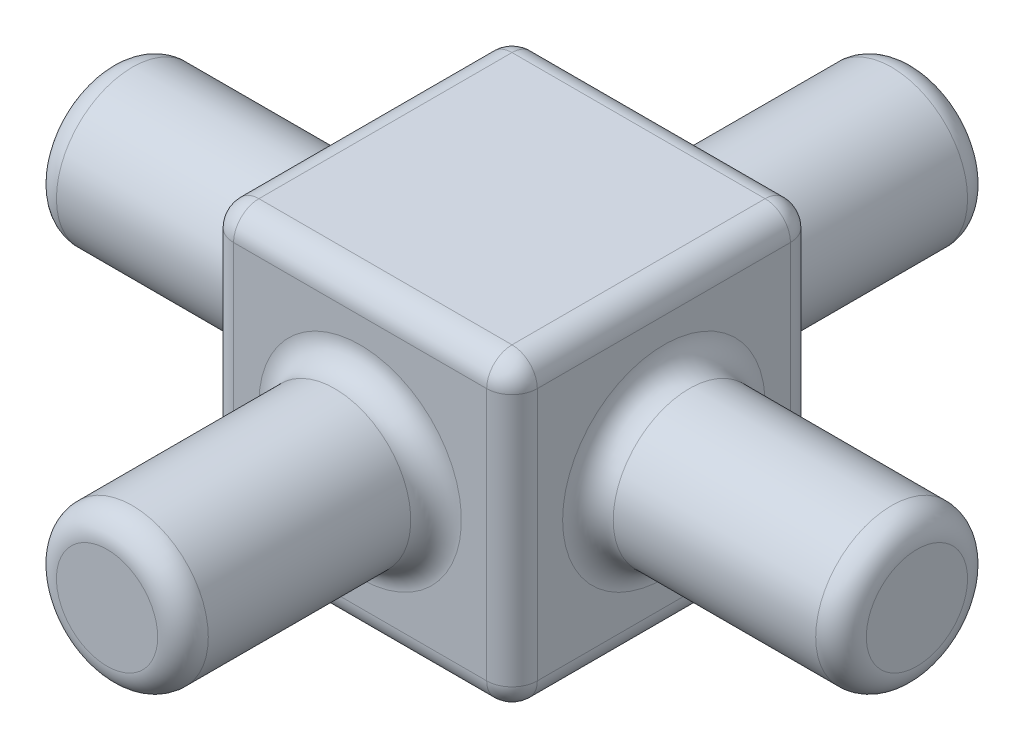
ISO-10303-21;
HEADER;
FILE_DESCRIPTION(('STEP AP214'),'2;1');
FILE_NAME('part.step','',(''),(''),'','','');
FILE_SCHEMA(('AUTOMOTIVE_DESIGN { 1 0 10303 214 1 1 1 1 }'));
ENDSEC;
DATA;
#1=APPLICATION_CONTEXT('core data for automotive mechanical design processes');
#2=APPLICATION_PROTOCOL_DEFINITION('international standard','automotive_design',2000,#1);
#3=PRODUCT_CONTEXT('',#1,'mechanical');
#4=PRODUCT('Part','Part','',(#3));
#5=PRODUCT_RELATED_PRODUCT_CATEGORY('part','',(#4));
#6=PRODUCT_DEFINITION_FORMATION('','',#4);
#7=PRODUCT_DEFINITION_CONTEXT('part definition',#1,'design');
#8=PRODUCT_DEFINITION('design','',#6,#7);
#9=PRODUCT_DEFINITION_SHAPE('','',#8);
#10=(LENGTH_UNIT() NAMED_UNIT(*) SI_UNIT(.MILLI.,.METRE.));
#11=(NAMED_UNIT(*) PLANE_ANGLE_UNIT() SI_UNIT($,.RADIAN.));
#12=(NAMED_UNIT(*) SI_UNIT($,.STERADIAN.) SOLID_ANGLE_UNIT());
#13=UNCERTAINTY_MEASURE_WITH_UNIT(LENGTH_MEASURE(1.E-05),#10,'distance_accuracy_value','');
#14=(GEOMETRIC_REPRESENTATION_CONTEXT(3) GLOBAL_UNCERTAINTY_ASSIGNED_CONTEXT((#13)) GLOBAL_UNIT_ASSIGNED_CONTEXT((#10,
#11,#12)) REPRESENTATION_CONTEXT('',''));
#15=CARTESIAN_POINT('',(0.,0.,0.));
#16=DIRECTION('',(0.,0.,1.));
#17=DIRECTION('',(1.,0.,0.));
#18=AXIS2_PLACEMENT_3D('',#15,#16,#17);
#19=CARTESIAN_POINT('',(3.,3.,3.));
#20=DIRECTION('',(-1.,0.,0.));
#21=DIRECTION('',(0.,0.,1.));
#22=AXIS2_PLACEMENT_3D('',#19,#20,#21);
#23=PLANE('',#22);
#24=CARTESIAN_POINT('',(3.,0.,0.));
#25=DIRECTION('',(-1.,0.,0.));
#26=DIRECTION('',(0.,0.,1.));
#27=AXIS2_PLACEMENT_3D('',#24,#25,#26);
#28=CIRCLE('',#27,2.);
#29=CARTESIAN_POINT('',(3.,0.,1.99999999999999));
#30=VERTEX_POINT('',#29);
#31=EDGE_CURVE('E169',#30,#30,#28,.T.);
#32=ORIENTED_EDGE('',*,*,#31,.T.);
#33=EDGE_LOOP('',(#32));
#34=FACE_BOUND('',#33,.T.);
#35=DIRECTION('',(0.,0.,-1.));
#36=VECTOR('',#35,1.);
#37=CARTESIAN_POINT('',(3.,-2.5,-3.));
#38=LINE('',#37,#36);
#39=CARTESIAN_POINT('',(3.,-2.5,2.5));
#40=VERTEX_POINT('',#39);
#41=CARTESIAN_POINT('',(3.,-2.5,-2.5));
#42=VERTEX_POINT('',#41);
#43=EDGE_CURVE('E167',#40,#42,#38,.T.);
#44=ORIENTED_EDGE('',*,*,#43,.T.);
#45=DIRECTION('',(0.,-1.,0.));
#46=VECTOR('',#45,1.);
#47=CARTESIAN_POINT('',(3.,3.,-2.5));
#48=LINE('',#47,#46);
#49=CARTESIAN_POINT('',(3.,2.5,-2.5));
#50=VERTEX_POINT('',#49);
#51=EDGE_CURVE('E159',#42,#50,#48,.F.);
#52=ORIENTED_EDGE('',*,*,#51,.T.);
#53=DIRECTION('',(0.,0.,-1.));
#54=VECTOR('',#53,1.);
#55=CARTESIAN_POINT('',(3.,2.5,3.));
#56=LINE('',#55,#54);
#57=CARTESIAN_POINT('',(3.,2.5,2.5));
#58=VERTEX_POINT('',#57);
#59=EDGE_CURVE('E129',#50,#58,#56,.F.);
#60=ORIENTED_EDGE('',*,*,#59,.T.);
#61=DIRECTION('',(0.,-1.,0.));
#62=VECTOR('',#61,1.);
#63=CARTESIAN_POINT('',(3.,3.,2.5));
#64=LINE('',#63,#62);
#65=EDGE_CURVE('E140',#58,#40,#64,.T.);
#66=ORIENTED_EDGE('',*,*,#65,.T.);
#67=EDGE_LOOP('',(#44,#52,#60,#66));
#68=FACE_BOUND('',#67,.T.);
#69=ADVANCED_FACE('F39',(#34,#68),#23,.F.);
#70=CARTESIAN_POINT('',(-3.,3.,-3.));
#71=DIRECTION('',(0.,0.,1.));
#72=DIRECTION('',(1.,0.,0.));
#73=AXIS2_PLACEMENT_3D('',#70,#71,#72);
#74=PLANE('',#73);
#75=CARTESIAN_POINT('',(0.,0.,-3.));
#76=DIRECTION('',(0.,0.,1.));
#77=DIRECTION('',(1.,0.,0.));
#78=AXIS2_PLACEMENT_3D('',#75,#76,#77);
#79=CIRCLE('',#78,2.);
#80=CARTESIAN_POINT('',(2.,0.,-3.));
#81=VERTEX_POINT('',#80);
#82=EDGE_CURVE('E236',#81,#81,#79,.T.);
#83=ORIENTED_EDGE('',*,*,#82,.T.);
#84=EDGE_LOOP('',(#83));
#85=FACE_BOUND('',#84,.T.);
#86=DIRECTION('',(-1.,0.,0.));
#87=VECTOR('',#86,1.);
#88=CARTESIAN_POINT('',(-3.,2.5,-3.));
#89=LINE('',#88,#87);
#90=CARTESIAN_POINT('',(-2.5,2.5,-3.));
#91=VERTEX_POINT('',#90);
#92=CARTESIAN_POINT('',(2.5,2.5,-3.));
#93=VERTEX_POINT('',#92);
#94=EDGE_CURVE('E225',#91,#93,#89,.F.);
#95=ORIENTED_EDGE('',*,*,#94,.T.);
#96=DIRECTION('',(0.,-1.,0.));
#97=VECTOR('',#96,1.);
#98=CARTESIAN_POINT('',(2.5,3.,-3.));
#99=LINE('',#98,#97);
#100=CARTESIAN_POINT('',(2.5,-2.5,-3.));
#101=VERTEX_POINT('',#100);
#102=EDGE_CURVE('E162',#93,#101,#99,.T.);
#103=ORIENTED_EDGE('',*,*,#102,.T.);
#104=DIRECTION('',(-1.,0.,0.));
#105=VECTOR('',#104,1.);
#106=CARTESIAN_POINT('',(-3.,-2.5,-3.));
#107=LINE('',#106,#105);
#108=CARTESIAN_POINT('',(-2.5,-2.5,-3.));
#109=VERTEX_POINT('',#108);
#110=EDGE_CURVE('E231',#101,#109,#107,.T.);
#111=ORIENTED_EDGE('',*,*,#110,.T.);
#112=DIRECTION('',(0.,-1.,0.));
#113=VECTOR('',#112,1.);
#114=CARTESIAN_POINT('',(-2.5,3.,-3.));
#115=LINE('',#114,#113);
#116=EDGE_CURVE('E228',#109,#91,#115,.F.);
#117=ORIENTED_EDGE('',*,*,#116,.T.);
#118=EDGE_LOOP('',(#95,#103,#111,#117));
#119=FACE_BOUND('',#118,.T.);
#120=ADVANCED_FACE('F417',(#85,#119),#74,.F.);
#121=CARTESIAN_POINT('',(-3.,3.,3.));
#122=DIRECTION('',(1.,0.,0.));
#123=DIRECTION('',(0.,0.,-1.));
#124=AXIS2_PLACEMENT_3D('',#121,#122,#123);
#125=PLANE('',#124);
#126=DIRECTION('',(0.,-1.,0.));
#127=VECTOR('',#126,1.);
#128=CARTESIAN_POINT('',(-3.,3.,-2.5));
#129=LINE('',#128,#127);
#130=CARTESIAN_POINT('',(-3.,2.5,-2.5));
#131=VERTEX_POINT('',#130);
#132=CARTESIAN_POINT('',(-3.,-2.5,-2.5));
#133=VERTEX_POINT('',#132);
#134=EDGE_CURVE('E218',#131,#133,#129,.T.);
#135=ORIENTED_EDGE('',*,*,#134,.T.);
#136=DIRECTION('',(0.,0.,1.));
#137=VECTOR('',#136,1.);
#138=CARTESIAN_POINT('',(-3.,-2.5,3.));
#139=LINE('',#138,#137);
#140=CARTESIAN_POINT('',(-3.,-2.5,2.5));
#141=VERTEX_POINT('',#140);
#142=EDGE_CURVE('E221',#133,#141,#139,.T.);
#143=ORIENTED_EDGE('',*,*,#142,.T.);
#144=DIRECTION('',(0.,-1.,0.));
#145=VECTOR('',#144,1.);
#146=CARTESIAN_POINT('',(-3.,3.,2.5));
#147=LINE('',#146,#145);
#148=CARTESIAN_POINT('',(-3.,2.5,2.5));
#149=VERTEX_POINT('',#148);
#150=EDGE_CURVE('E212',#141,#149,#147,.F.);
#151=ORIENTED_EDGE('',*,*,#150,.T.);
#152=DIRECTION('',(0.,0.,1.));
#153=VECTOR('',#152,1.);
#154=CARTESIAN_POINT('',(-3.,2.5,3.));
#155=LINE('',#154,#153);
#156=EDGE_CURVE('E215',#149,#131,#155,.F.);
#157=ORIENTED_EDGE('',*,*,#156,.T.);
#158=EDGE_LOOP('',(#135,#143,#151,#157));
#159=FACE_BOUND('',#158,.T.);
#160=CARTESIAN_POINT('',(-3.,0.,0.));
#161=DIRECTION('',(1.,0.,0.));
#162=DIRECTION('',(0.,0.,-1.));
#163=AXIS2_PLACEMENT_3D('',#160,#161,#162);
#164=CIRCLE('',#163,2.);
#165=CARTESIAN_POINT('',(-3.,0.,-1.99999999999996));
#166=VERTEX_POINT('',#165);
#167=EDGE_CURVE('E208',#166,#166,#164,.T.);
#168=ORIENTED_EDGE('',*,*,#167,.T.);
#169=EDGE_LOOP('',(#168));
#170=FACE_BOUND('',#169,.T.);
#171=ADVANCED_FACE('F423',(#159,#170),#125,.F.);
#172=CARTESIAN_POINT('',(-3.,3.,3.));
#173=DIRECTION('',(0.,0.,-1.));
#174=DIRECTION('',(-1.,0.,0.));
#175=AXIS2_PLACEMENT_3D('',#172,#173,#174);
#176=PLANE('',#175);
#177=CARTESIAN_POINT('',(0.,0.,3.));
#178=DIRECTION('',(0.,0.,-1.));
#179=DIRECTION('',(-1.,0.,0.));
#180=AXIS2_PLACEMENT_3D('',#177,#178,#179);
#181=CIRCLE('',#180,2.);
#182=CARTESIAN_POINT('',(-2.,0.,3.));
#183=VERTEX_POINT('',#182);
#184=EDGE_CURVE('E191',#183,#183,#181,.T.);
#185=ORIENTED_EDGE('',*,*,#184,.T.);
#186=EDGE_LOOP('',(#185));
#187=FACE_BOUND('',#186,.T.);
#188=DIRECTION('',(0.,-1.,0.));
#189=VECTOR('',#188,1.);
#190=CARTESIAN_POINT('',(-2.5,3.,3.));
#191=LINE('',#190,#189);
#192=CARTESIAN_POINT('',(-2.5,2.5,3.));
#193=VERTEX_POINT('',#192);
#194=CARTESIAN_POINT('',(-2.5,-2.5,3.));
#195=VERTEX_POINT('',#194);
#196=EDGE_CURVE('E184',#193,#195,#191,.T.);
#197=ORIENTED_EDGE('',*,*,#196,.T.);
#198=DIRECTION('',(1.,0.,0.));
#199=VECTOR('',#198,1.);
#200=CARTESIAN_POINT('',(3.,-2.5,3.));
#201=LINE('',#200,#199);
#202=CARTESIAN_POINT('',(2.5,-2.5,3.));
#203=VERTEX_POINT('',#202);
#204=EDGE_CURVE('E187',#195,#203,#201,.T.);
#205=ORIENTED_EDGE('',*,*,#204,.T.);
#206=DIRECTION('',(0.,-1.,0.));
#207=VECTOR('',#206,1.);
#208=CARTESIAN_POINT('',(2.5,3.,3.));
#209=LINE('',#208,#207);
#210=CARTESIAN_POINT('',(2.5,2.5,3.));
#211=VERTEX_POINT('',#210);
#212=EDGE_CURVE('E181',#203,#211,#209,.F.);
#213=ORIENTED_EDGE('',*,*,#212,.T.);
#214=DIRECTION('',(1.,0.,0.));
#215=VECTOR('',#214,1.);
#216=CARTESIAN_POINT('',(-3.,2.5,3.));
#217=LINE('',#216,#215);
#218=EDGE_CURVE('E174',#211,#193,#217,.F.);
#219=ORIENTED_EDGE('',*,*,#218,.T.);
#220=EDGE_LOOP('',(#197,#205,#213,#219));
#221=FACE_BOUND('',#220,.T.);
#222=ADVANCED_FACE('F497',(#187,#221),#176,.F.);
#223=CARTESIAN_POINT('',(0.,3.,0.));
#224=DIRECTION('',(0.,-1.,0.));
#225=DIRECTION('',(0.,0.,-1.));
#226=AXIS2_PLACEMENT_3D('',#223,#224,#225);
#227=PLANE('',#226);
#228=DIRECTION('',(0.,0.,-1.));
#229=VECTOR('',#228,1.);
#230=CARTESIAN_POINT('',(2.5,3.,0.));
#231=LINE('',#230,#229);
#232=CARTESIAN_POINT('',(2.5,3.,2.5));
#233=VERTEX_POINT('',#232);
#234=CARTESIAN_POINT('',(2.5,3.,-2.5));
#235=VERTEX_POINT('',#234);
#236=EDGE_CURVE('E240',#233,#235,#231,.T.);
#237=ORIENTED_EDGE('',*,*,#236,.T.);
#238=DIRECTION('',(-1.,0.,0.));
#239=VECTOR('',#238,1.);
#240=CARTESIAN_POINT('',(0.,3.,-2.5));
#241=LINE('',#240,#239);
#242=CARTESIAN_POINT('',(-2.5,3.,-2.5));
#243=VERTEX_POINT('',#242);
#244=EDGE_CURVE('E11',#235,#243,#241,.T.);
#245=ORIENTED_EDGE('',*,*,#244,.T.);
#246=DIRECTION('',(0.,0.,1.));
#247=VECTOR('',#246,1.);
#248=CARTESIAN_POINT('',(-2.5,3.,0.));
#249=LINE('',#248,#247);
#250=CARTESIAN_POINT('',(-2.5,3.,2.5));
#251=VERTEX_POINT('',#250);
#252=EDGE_CURVE('E49',#243,#251,#249,.T.);
#253=ORIENTED_EDGE('',*,*,#252,.T.);
#254=DIRECTION('',(1.,0.,0.));
#255=VECTOR('',#254,1.);
#256=CARTESIAN_POINT('',(0.,3.,2.5));
#257=LINE('',#256,#255);
#258=EDGE_CURVE('E243',#251,#233,#257,.T.);
#259=ORIENTED_EDGE('',*,*,#258,.T.);
#260=EDGE_LOOP('',(#237,#245,#253,#259));
#261=FACE_BOUND('',#260,.T.);
#262=ADVANCED_FACE('F491',(#261),#227,.F.);
#263=CARTESIAN_POINT('',(0.,-3.,0.));
#264=DIRECTION('',(0.,-1.,0.));
#265=DIRECTION('',(0.,0.,-1.));
#266=AXIS2_PLACEMENT_3D('',#263,#264,#265);
#267=PLANE('',#266);
#268=DIRECTION('',(0.,0.,-1.));
#269=VECTOR('',#268,1.);
#270=CARTESIAN_POINT('',(2.5,-3.,3.));
#271=LINE('',#270,#269);
#272=CARTESIAN_POINT('',(2.5,-3.,-2.5));
#273=VERTEX_POINT('',#272);
#274=CARTESIAN_POINT('',(2.5,-3.,2.5));
#275=VERTEX_POINT('',#274);
#276=EDGE_CURVE('E198',#273,#275,#271,.F.);
#277=ORIENTED_EDGE('',*,*,#276,.T.);
#278=DIRECTION('',(1.,0.,0.));
#279=VECTOR('',#278,1.);
#280=CARTESIAN_POINT('',(-3.,-3.,2.5));
#281=LINE('',#280,#279);
#282=CARTESIAN_POINT('',(-2.5,-3.,2.5));
#283=VERTEX_POINT('',#282);
#284=EDGE_CURVE('E204',#275,#283,#281,.F.);
#285=ORIENTED_EDGE('',*,*,#284,.T.);
#286=DIRECTION('',(0.,0.,1.));
#287=VECTOR('',#286,1.);
#288=CARTESIAN_POINT('',(-2.5,-3.,-3.));
#289=LINE('',#288,#287);
#290=CARTESIAN_POINT('',(-2.5,-3.,-2.5));
#291=VERTEX_POINT('',#290);
#292=EDGE_CURVE('E201',#283,#291,#289,.F.);
#293=ORIENTED_EDGE('',*,*,#292,.T.);
#294=DIRECTION('',(-1.,0.,0.));
#295=VECTOR('',#294,1.);
#296=CARTESIAN_POINT('',(3.,-3.,-2.5));
#297=LINE('',#296,#295);
#298=EDGE_CURVE('E195',#291,#273,#297,.F.);
#299=ORIENTED_EDGE('',*,*,#298,.T.);
#300=EDGE_LOOP('',(#277,#285,#293,#299));
#301=FACE_BOUND('',#300,.T.);
#302=ADVANCED_FACE('F392',(#301),#267,.T.);
#303=CARTESIAN_POINT('',(0.,0.,8.));
#304=DIRECTION('',(0.,0.,-1.));
#305=DIRECTION('',(-1.,0.,0.));
#306=AXIS2_PLACEMENT_3D('',#303,#304,#305);
#307=CYLINDRICAL_SURFACE('',#306,1.5);
#308=CARTESIAN_POINT('',(0.,0.,7.5));
#309=DIRECTION('',(0.,0.,1.));
#310=DIRECTION('',(1.,0.,0.));
#311=AXIS2_PLACEMENT_3D('',#308,#309,#310);
#312=CIRCLE('',#311,1.5);
#313=CARTESIAN_POINT('',(1.5,0.,7.5));
#314=VERTEX_POINT('',#313);
#315=EDGE_CURVE('E358',#314,#314,#312,.F.);
#316=ORIENTED_EDGE('',*,*,#315,.T.);
#317=EDGE_LOOP('',(#316));
#318=FACE_BOUND('',#317,.T.);
#319=CARTESIAN_POINT('',(0.,0.,3.5));
#320=DIRECTION('',(0.,0.,-1.));
#321=DIRECTION('',(-1.,0.,0.));
#322=AXIS2_PLACEMENT_3D('',#319,#320,#321);
#323=CIRCLE('',#322,1.5);
#324=CARTESIAN_POINT('',(-1.5,0.,3.5));
#325=VERTEX_POINT('',#324);
#326=EDGE_CURVE('E354',#325,#325,#323,.F.);
#327=ORIENTED_EDGE('',*,*,#326,.T.);
#328=EDGE_LOOP('',(#327));
#329=FACE_BOUND('',#328,.T.);
#330=ADVANCED_FACE('F508',(#318,#329),#307,.T.);
#331=CARTESIAN_POINT('',(0.,0.,8.));
#332=DIRECTION('',(0.,0.,1.));
#333=DIRECTION('',(1.,0.,0.));
#334=AXIS2_PLACEMENT_3D('',#331,#332,#333);
#335=PLANE('',#334);
#336=CARTESIAN_POINT('',(0.,0.,8.));
#337=DIRECTION('',(0.,0.,1.));
#338=DIRECTION('',(1.,0.,0.));
#339=AXIS2_PLACEMENT_3D('',#336,#337,#338);
#340=CIRCLE('',#339,1.);
#341=CARTESIAN_POINT('',(1.,0.,8.));
#342=VERTEX_POINT('',#341);
#343=EDGE_CURVE('E350',#342,#342,#340,.T.);
#344=ORIENTED_EDGE('',*,*,#343,.T.);
#345=EDGE_LOOP('',(#344));
#346=FACE_BOUND('',#345,.T.);
#347=ADVANCED_FACE('F512',(#346),#335,.T.);
#348=CARTESIAN_POINT('',(8.,0.,0.));
#349=DIRECTION('',(-1.,0.,0.));
#350=DIRECTION('',(0.,0.,1.));
#351=AXIS2_PLACEMENT_3D('',#348,#349,#350);
#352=CYLINDRICAL_SURFACE('',#351,1.5);
#353=CARTESIAN_POINT('',(7.5,0.,0.));
#354=DIRECTION('',(1.,0.,0.));
#355=DIRECTION('',(0.,0.,-1.));
#356=AXIS2_PLACEMENT_3D('',#353,#354,#355);
#357=CIRCLE('',#356,1.5);
#358=CARTESIAN_POINT('',(7.49999999999999,0.,-1.50000000000003));
#359=VERTEX_POINT('',#358);
#360=EDGE_CURVE('E141',#359,#359,#357,.F.);
#361=ORIENTED_EDGE('',*,*,#360,.T.);
#362=EDGE_LOOP('',(#361));
#363=FACE_BOUND('',#362,.T.);
#364=CARTESIAN_POINT('',(3.5,0.,0.));
#365=DIRECTION('',(-1.,0.,0.));
#366=DIRECTION('',(0.,0.,1.));
#367=AXIS2_PLACEMENT_3D('',#364,#365,#366);
#368=CIRCLE('',#367,1.5);
#369=CARTESIAN_POINT('',(3.5,0.,1.49999999999999));
#370=VERTEX_POINT('',#369);
#371=EDGE_CURVE('E366',#370,#370,#368,.F.);
#372=ORIENTED_EDGE('',*,*,#371,.T.);
#373=EDGE_LOOP('',(#372));
#374=FACE_BOUND('',#373,.T.);
#375=ADVANCED_FACE('F516',(#363,#374),#352,.T.);
#376=CARTESIAN_POINT('',(8.,0.,0.));
#377=DIRECTION('',(1.,0.,0.));
#378=DIRECTION('',(0.,0.,-1.));
#379=AXIS2_PLACEMENT_3D('',#376,#377,#378);
#380=PLANE('',#379);
#381=CARTESIAN_POINT('',(8.,0.,0.));
#382=DIRECTION('',(1.,0.,0.));
#383=DIRECTION('',(0.,0.,-1.));
#384=AXIS2_PLACEMENT_3D('',#381,#382,#383);
#385=CIRCLE('',#384,1.);
#386=CARTESIAN_POINT('',(8.,0.,-1.00000000000003));
#387=VERTEX_POINT('',#386);
#388=EDGE_CURVE('E362',#387,#387,#385,.T.);
#389=ORIENTED_EDGE('',*,*,#388,.T.);
#390=EDGE_LOOP('',(#389));
#391=FACE_BOUND('',#390,.T.);
#392=ADVANCED_FACE('F520',(#391),#380,.T.);
#393=CARTESIAN_POINT('',(0.,0.,-8.));
#394=DIRECTION('',(0.,0.,1.));
#395=DIRECTION('',(1.,0.,0.));
#396=AXIS2_PLACEMENT_3D('',#393,#394,#395);
#397=CYLINDRICAL_SURFACE('',#396,1.5);
#398=CARTESIAN_POINT('',(0.,0.,-7.5));
#399=DIRECTION('',(0.,0.,-1.));
#400=DIRECTION('',(-1.,0.,0.));
#401=AXIS2_PLACEMENT_3D('',#398,#399,#400);
#402=CIRCLE('',#401,1.5);
#403=CARTESIAN_POINT('',(-1.5,0.,-7.5));
#404=VERTEX_POINT('',#403);
#405=EDGE_CURVE('E346',#404,#404,#402,.F.);
#406=ORIENTED_EDGE('',*,*,#405,.T.);
#407=EDGE_LOOP('',(#406));
#408=FACE_BOUND('',#407,.T.);
#409=CARTESIAN_POINT('',(0.,0.,-3.5));
#410=DIRECTION('',(0.,0.,1.));
#411=DIRECTION('',(1.,0.,0.));
#412=AXIS2_PLACEMENT_3D('',#409,#410,#411);
#413=CIRCLE('',#412,1.5);
#414=CARTESIAN_POINT('',(1.5,0.,-3.5));
#415=VERTEX_POINT('',#414);
#416=EDGE_CURVE('E342',#415,#415,#413,.F.);
#417=ORIENTED_EDGE('',*,*,#416,.T.);
#418=EDGE_LOOP('',(#417));
#419=FACE_BOUND('',#418,.T.);
#420=ADVANCED_FACE('F524',(#408,#419),#397,.T.);
#421=CARTESIAN_POINT('',(0.,0.,-8.));
#422=DIRECTION('',(0.,0.,-1.));
#423=DIRECTION('',(-1.,0.,0.));
#424=AXIS2_PLACEMENT_3D('',#421,#422,#423);
#425=PLANE('',#424);
#426=CARTESIAN_POINT('',(0.,0.,-8.));
#427=DIRECTION('',(0.,0.,-1.));
#428=DIRECTION('',(-1.,0.,0.));
#429=AXIS2_PLACEMENT_3D('',#426,#427,#428);
#430=CIRCLE('',#429,1.);
#431=CARTESIAN_POINT('',(-1.,0.,-8.));
#432=VERTEX_POINT('',#431);
#433=EDGE_CURVE('E338',#432,#432,#430,.T.);
#434=ORIENTED_EDGE('',*,*,#433,.T.);
#435=EDGE_LOOP('',(#434));
#436=FACE_BOUND('',#435,.T.);
#437=ADVANCED_FACE('F528',(#436),#425,.T.);
#438=CARTESIAN_POINT('',(-8.,0.,0.));
#439=DIRECTION('',(1.,0.,0.));
#440=DIRECTION('',(0.,0.,-1.));
#441=AXIS2_PLACEMENT_3D('',#438,#439,#440);
#442=CYLINDRICAL_SURFACE('',#441,1.5);
#443=CARTESIAN_POINT('',(-7.5,0.,0.));
#444=DIRECTION('',(-1.,0.,0.));
#445=DIRECTION('',(0.,0.,1.));
#446=AXIS2_PLACEMENT_3D('',#443,#444,#445);
#447=CIRCLE('',#446,1.5);
#448=CARTESIAN_POINT('',(-7.49999999999998,0.,1.50000000000008));
#449=VERTEX_POINT('',#448);
#450=EDGE_CURVE('E332',#449,#449,#447,.F.);
#451=ORIENTED_EDGE('',*,*,#450,.T.);
#452=EDGE_LOOP('',(#451));
#453=FACE_BOUND('',#452,.T.);
#454=CARTESIAN_POINT('',(-3.50000000000001,0.,0.));
#455=DIRECTION('',(1.,0.,0.));
#456=DIRECTION('',(0.,0.,-1.));
#457=AXIS2_PLACEMENT_3D('',#454,#455,#456);
#458=CIRCLE('',#457,1.5);
#459=CARTESIAN_POINT('',(-3.50000000000001,0.,-1.49999999999996));
#460=VERTEX_POINT('',#459);
#461=EDGE_CURVE('E326',#460,#460,#458,.F.);
#462=ORIENTED_EDGE('',*,*,#461,.T.);
#463=EDGE_LOOP('',(#462));
#464=FACE_BOUND('',#463,.T.);
#465=ADVANCED_FACE('F532',(#453,#464),#442,.T.);
#466=CARTESIAN_POINT('',(-8.,0.,0.));
#467=DIRECTION('',(-1.,0.,0.));
#468=DIRECTION('',(0.,0.,1.));
#469=AXIS2_PLACEMENT_3D('',#466,#467,#468);
#470=PLANE('',#469);
#471=CARTESIAN_POINT('',(-8.,0.,0.));
#472=DIRECTION('',(-1.,0.,0.));
#473=DIRECTION('',(0.,0.,1.));
#474=AXIS2_PLACEMENT_3D('',#471,#472,#473);
#475=CIRCLE('',#474,1.);
#476=CARTESIAN_POINT('',(-7.99999999999999,0.,1.00000000000008));
#477=VERTEX_POINT('',#476);
#478=EDGE_CURVE('E320',#477,#477,#475,.T.);
#479=ORIENTED_EDGE('',*,*,#478,.T.);
#480=EDGE_LOOP('',(#479));
#481=FACE_BOUND('',#480,.T.);
#482=ADVANCED_FACE('F432',(#481),#470,.T.);
#483=CARTESIAN_POINT('',(-7.5,0.,0.));
#484=DIRECTION('',(-1.,0.,0.));
#485=DIRECTION('',(0.,0.,1.));
#486=AXIS2_PLACEMENT_3D('',#483,#484,#485);
#487=TOROIDAL_SURFACE('',#486,1.,0.5);
#488=ORIENTED_EDGE('',*,*,#450,.F.);
#489=EDGE_LOOP('',(#488));
#490=FACE_BOUND('',#489,.T.);
#491=ORIENTED_EDGE('',*,*,#478,.F.);
#492=EDGE_LOOP('',(#491));
#493=FACE_BOUND('',#492,.T.);
#494=ADVANCED_FACE('F428',(#490,#493),#487,.T.);
#495=CARTESIAN_POINT('',(0.,0.,-7.5));
#496=DIRECTION('',(0.,0.,-1.));
#497=DIRECTION('',(-1.,0.,0.));
#498=AXIS2_PLACEMENT_3D('',#495,#496,#497);
#499=TOROIDAL_SURFACE('',#498,1.,0.5);
#500=ORIENTED_EDGE('',*,*,#405,.F.);
#501=EDGE_LOOP('',(#500));
#502=FACE_BOUND('',#501,.T.);
#503=ORIENTED_EDGE('',*,*,#433,.F.);
#504=EDGE_LOOP('',(#503));
#505=FACE_BOUND('',#504,.T.);
#506=ADVANCED_FACE('F431',(#502,#505),#499,.T.);
#507=CARTESIAN_POINT('',(0.,0.,7.5));
#508=DIRECTION('',(0.,0.,1.));
#509=DIRECTION('',(1.,0.,0.));
#510=AXIS2_PLACEMENT_3D('',#507,#508,#509);
#511=TOROIDAL_SURFACE('',#510,1.,0.5);
#512=ORIENTED_EDGE('',*,*,#315,.F.);
#513=EDGE_LOOP('',(#512));
#514=FACE_BOUND('',#513,.T.);
#515=ORIENTED_EDGE('',*,*,#343,.F.);
#516=EDGE_LOOP('',(#515));
#517=FACE_BOUND('',#516,.T.);
#518=ADVANCED_FACE('F436',(#514,#517),#511,.T.);
#519=CARTESIAN_POINT('',(7.5,0.,0.));
#520=DIRECTION('',(1.,0.,0.));
#521=DIRECTION('',(0.,0.,-1.));
#522=AXIS2_PLACEMENT_3D('',#519,#520,#521);
#523=TOROIDAL_SURFACE('',#522,1.,0.5);
#524=ORIENTED_EDGE('',*,*,#360,.F.);
#525=EDGE_LOOP('',(#524));
#526=FACE_BOUND('',#525,.T.);
#527=ORIENTED_EDGE('',*,*,#388,.F.);
#528=EDGE_LOOP('',(#527));
#529=FACE_BOUND('',#528,.T.);
#530=ADVANCED_FACE('F440',(#526,#529),#523,.T.);
#531=CARTESIAN_POINT('',(3.5,0.,0.));
#532=DIRECTION('',(-1.,0.,0.));
#533=DIRECTION('',(0.,0.,1.));
#534=AXIS2_PLACEMENT_3D('',#531,#532,#533);
#535=TOROIDAL_SURFACE('',#534,2.,0.5);
#536=ORIENTED_EDGE('',*,*,#31,.F.);
#537=EDGE_LOOP('',(#536));
#538=FACE_BOUND('',#537,.T.);
#539=ORIENTED_EDGE('',*,*,#371,.F.);
#540=EDGE_LOOP('',(#539));
#541=FACE_BOUND('',#540,.T.);
#542=ADVANCED_FACE('F444',(#538,#541),#535,.F.);
#543=CARTESIAN_POINT('',(0.,2.5,-2.5));
#544=DIRECTION('',(-1.,0.,0.));
#545=DIRECTION('',(0.,0.,1.));
#546=AXIS2_PLACEMENT_3D('',#543,#544,#545);
#547=CYLINDRICAL_SURFACE('',#546,0.5);
#548=CARTESIAN_POINT('',(-2.5,2.5,-2.5));
#549=DIRECTION('',(-1.,0.,0.));
#550=DIRECTION('',(0.,0.,1.));
#551=AXIS2_PLACEMENT_3D('',#548,#549,#550);
#552=CIRCLE('',#551,0.5);
#553=EDGE_CURVE('E43',#243,#91,#552,.T.);
#554=ORIENTED_EDGE('',*,*,#553,.F.);
#555=ORIENTED_EDGE('',*,*,#244,.F.);
#556=CARTESIAN_POINT('',(2.5,2.5,-2.5));
#557=DIRECTION('',(1.,0.,0.));
#558=DIRECTION('',(0.,1.,0.));
#559=AXIS2_PLACEMENT_3D('',#556,#557,#558);
#560=CIRCLE('',#559,0.5);
#561=EDGE_CURVE('E151',#93,#235,#560,.T.);
#562=ORIENTED_EDGE('',*,*,#561,.F.);
#563=ORIENTED_EDGE('',*,*,#94,.F.);
#564=EDGE_LOOP('',(#554,#555,#562,#563));
#565=FACE_BOUND('',#564,.T.);
#566=ADVANCED_FACE('F448',(#565),#547,.T.);
#567=CARTESIAN_POINT('',(-2.5,2.5,-2.5));
#568=DIRECTION('',(0.,0.,1.));
#569=DIRECTION('',(1.,0.,0.));
#570=AXIS2_PLACEMENT_3D('',#567,#568,#569);
#571=SPHERICAL_SURFACE('',#570,0.5);
#572=CARTESIAN_POINT('',(-2.5,2.5,-2.5));
#573=DIRECTION('',(0.,0.,-1.));
#574=DIRECTION('',(0.,1.,0.));
#575=AXIS2_PLACEMENT_3D('',#572,#573,#574);
#576=CIRCLE('',#575,0.5);
#577=EDGE_CURVE('E153',#243,#131,#576,.F.);
#578=ORIENTED_EDGE('',*,*,#577,.F.);
#579=ORIENTED_EDGE('',*,*,#553,.T.);
#580=CARTESIAN_POINT('',(-2.5,2.5,-2.5));
#581=DIRECTION('',(0.,1.,0.));
#582=DIRECTION('',(0.,0.,1.));
#583=AXIS2_PLACEMENT_3D('',#580,#581,#582);
#584=CIRCLE('',#583,0.5);
#585=EDGE_CURVE('E314',#131,#91,#584,.F.);
#586=ORIENTED_EDGE('',*,*,#585,.F.);
#587=EDGE_LOOP('',(#578,#579,#586));
#588=FACE_BOUND('',#587,.T.);
#589=ADVANCED_FACE('F568',(#588),#571,.T.);
#590=CARTESIAN_POINT('',(2.5,2.5,-2.5));
#591=DIRECTION('',(0.,0.,1.));
#592=DIRECTION('',(1.,0.,0.));
#593=AXIS2_PLACEMENT_3D('',#590,#591,#592);
#594=SPHERICAL_SURFACE('',#593,0.5);
#595=CARTESIAN_POINT('',(2.5,2.5,-2.5));
#596=DIRECTION('',(0.,1.,0.));
#597=DIRECTION('',(0.,0.,1.));
#598=AXIS2_PLACEMENT_3D('',#595,#596,#597);
#599=CIRCLE('',#598,0.5);
#600=EDGE_CURVE('E148',#93,#50,#599,.F.);
#601=ORIENTED_EDGE('',*,*,#600,.F.);
#602=ORIENTED_EDGE('',*,*,#561,.T.);
#603=CARTESIAN_POINT('',(2.5,2.5,-2.5));
#604=DIRECTION('',(0.,0.,-1.));
#605=DIRECTION('',(-1.,0.,0.));
#606=AXIS2_PLACEMENT_3D('',#603,#604,#605);
#607=CIRCLE('',#606,0.5);
#608=EDGE_CURVE('E133',#50,#235,#607,.F.);
#609=ORIENTED_EDGE('',*,*,#608,.F.);
#610=EDGE_LOOP('',(#601,#602,#609));
#611=FACE_BOUND('',#610,.T.);
#612=ADVANCED_FACE('F147',(#611),#594,.T.);
#613=CARTESIAN_POINT('',(-2.5,3.,-2.5));
#614=DIRECTION('',(0.,-1.,0.));
#615=DIRECTION('',(0.,0.,-1.));
#616=AXIS2_PLACEMENT_3D('',#613,#614,#615);
#617=CYLINDRICAL_SURFACE('',#616,0.5);
#618=ORIENTED_EDGE('',*,*,#585,.T.);
#619=ORIENTED_EDGE('',*,*,#116,.F.);
#620=CARTESIAN_POINT('',(-2.5,-2.5,-2.5));
#621=DIRECTION('',(0.,-1.,0.));
#622=DIRECTION('',(0.,0.,-1.));
#623=AXIS2_PLACEMENT_3D('',#620,#621,#622);
#624=CIRCLE('',#623,0.5);
#625=EDGE_CURVE('E305',#133,#109,#624,.T.);
#626=ORIENTED_EDGE('',*,*,#625,.F.);
#627=ORIENTED_EDGE('',*,*,#134,.F.);
#628=EDGE_LOOP('',(#618,#619,#626,#627));
#629=FACE_BOUND('',#628,.T.);
#630=ADVANCED_FACE('F486',(#629),#617,.T.);
#631=CARTESIAN_POINT('',(-2.5,2.5,0.));
#632=DIRECTION('',(0.,0.,1.));
#633=DIRECTION('',(1.,0.,0.));
#634=AXIS2_PLACEMENT_3D('',#631,#632,#633);
#635=CYLINDRICAL_SURFACE('',#634,0.5);
#636=ORIENTED_EDGE('',*,*,#577,.T.);
#637=ORIENTED_EDGE('',*,*,#156,.F.);
#638=CARTESIAN_POINT('',(-2.5,2.5,2.5));
#639=DIRECTION('',(0.,0.,1.));
#640=DIRECTION('',(1.,0.,0.));
#641=AXIS2_PLACEMENT_3D('',#638,#639,#640);
#642=CIRCLE('',#641,0.5);
#643=EDGE_CURVE('E301',#251,#149,#642,.T.);
#644=ORIENTED_EDGE('',*,*,#643,.F.);
#645=ORIENTED_EDGE('',*,*,#252,.F.);
#646=EDGE_LOOP('',(#636,#637,#644,#645));
#647=FACE_BOUND('',#646,.T.);
#648=ADVANCED_FACE('F474',(#647),#635,.T.);
#649=CARTESIAN_POINT('',(0.,2.5,2.5));
#650=DIRECTION('',(1.,0.,0.));
#651=DIRECTION('',(0.,0.,-1.));
#652=AXIS2_PLACEMENT_3D('',#649,#650,#651);
#653=CYLINDRICAL_SURFACE('',#652,0.5);
#654=CARTESIAN_POINT('',(2.5,2.5,2.5));
#655=DIRECTION('',(1.,0.,0.));
#656=DIRECTION('',(0.,0.,-1.));
#657=AXIS2_PLACEMENT_3D('',#654,#655,#656);
#658=CIRCLE('',#657,0.5);
#659=EDGE_CURVE('E293',#233,#211,#658,.T.);
#660=ORIENTED_EDGE('',*,*,#659,.F.);
#661=ORIENTED_EDGE('',*,*,#258,.F.);
#662=CARTESIAN_POINT('',(-2.5,2.5,2.5));
#663=DIRECTION('',(-1.,0.,0.));
#664=DIRECTION('',(0.,0.,1.));
#665=AXIS2_PLACEMENT_3D('',#662,#663,#664);
#666=CIRCLE('',#665,0.5);
#667=EDGE_CURVE('E297',#193,#251,#666,.T.);
#668=ORIENTED_EDGE('',*,*,#667,.F.);
#669=ORIENTED_EDGE('',*,*,#218,.F.);
#670=EDGE_LOOP('',(#660,#661,#668,#669));
#671=FACE_BOUND('',#670,.T.);
#672=ADVANCED_FACE('F495',(#671),#653,.T.);
#673=CARTESIAN_POINT('',(2.5,2.5,0.));
#674=DIRECTION('',(0.,0.,-1.));
#675=DIRECTION('',(-1.,0.,0.));
#676=AXIS2_PLACEMENT_3D('',#673,#674,#675);
#677=CYLINDRICAL_SURFACE('',#676,0.5);
#678=ORIENTED_EDGE('',*,*,#608,.T.);
#679=ORIENTED_EDGE('',*,*,#236,.F.);
#680=CARTESIAN_POINT('',(2.5,2.5,2.5));
#681=DIRECTION('',(0.,0.,1.));
#682=DIRECTION('',(1.,0.,0.));
#683=AXIS2_PLACEMENT_3D('',#680,#681,#682);
#684=CIRCLE('',#683,0.5);
#685=EDGE_CURVE('E135',#58,#233,#684,.T.);
#686=ORIENTED_EDGE('',*,*,#685,.F.);
#687=ORIENTED_EDGE('',*,*,#59,.F.);
#688=EDGE_LOOP('',(#678,#679,#686,#687));
#689=FACE_BOUND('',#688,.T.);
#690=ADVANCED_FACE('F131',(#689),#677,.T.);
#691=CARTESIAN_POINT('',(2.5,3.,-2.5));
#692=DIRECTION('',(0.,-1.,0.));
#693=DIRECTION('',(0.,0.,-1.));
#694=AXIS2_PLACEMENT_3D('',#691,#692,#693);
#695=CYLINDRICAL_SURFACE('',#694,0.5);
#696=ORIENTED_EDGE('',*,*,#600,.T.);
#697=ORIENTED_EDGE('',*,*,#51,.F.);
#698=CARTESIAN_POINT('',(2.5,-2.5,-2.5));
#699=DIRECTION('',(0.,-1.,0.));
#700=DIRECTION('',(0.,0.,-1.));
#701=AXIS2_PLACEMENT_3D('',#698,#699,#700);
#702=CIRCLE('',#701,0.5);
#703=EDGE_CURVE('E288',#101,#42,#702,.T.);
#704=ORIENTED_EDGE('',*,*,#703,.F.);
#705=ORIENTED_EDGE('',*,*,#102,.F.);
#706=EDGE_LOOP('',(#696,#697,#704,#705));
#707=FACE_BOUND('',#706,.T.);
#708=ADVANCED_FACE('F157',(#707),#695,.T.);
#709=CARTESIAN_POINT('',(-3.,-2.5,-2.5));
#710=DIRECTION('',(1.,0.,0.));
#711=DIRECTION('',(0.,0.,-1.));
#712=AXIS2_PLACEMENT_3D('',#709,#710,#711);
#713=CYLINDRICAL_SURFACE('',#712,0.5);
#714=CARTESIAN_POINT('',(-2.5,-2.5,-2.5));
#715=DIRECTION('',(-1.,0.,0.));
#716=DIRECTION('',(0.,0.,1.));
#717=AXIS2_PLACEMENT_3D('',#714,#715,#716);
#718=CIRCLE('',#717,0.5);
#719=EDGE_CURVE('E164',#109,#291,#718,.T.);
#720=ORIENTED_EDGE('',*,*,#719,.F.);
#721=ORIENTED_EDGE('',*,*,#110,.F.);
#722=CARTESIAN_POINT('',(2.5,-2.5,-2.5));
#723=DIRECTION('',(1.,0.,0.));
#724=DIRECTION('',(0.,0.,-1.));
#725=AXIS2_PLACEMENT_3D('',#722,#723,#724);
#726=CIRCLE('',#725,0.5);
#727=EDGE_CURVE('E285',#273,#101,#726,.T.);
#728=ORIENTED_EDGE('',*,*,#727,.F.);
#729=ORIENTED_EDGE('',*,*,#298,.F.);
#730=EDGE_LOOP('',(#720,#721,#728,#729));
#731=FACE_BOUND('',#730,.T.);
#732=ADVANCED_FACE('F399',(#731),#713,.T.);
#733=CARTESIAN_POINT('',(-2.5,-2.5,-2.5));
#734=DIRECTION('',(0.,0.,1.));
#735=DIRECTION('',(1.,0.,0.));
#736=AXIS2_PLACEMENT_3D('',#733,#734,#735);
#737=SPHERICAL_SURFACE('',#736,0.5);
#738=ORIENTED_EDGE('',*,*,#625,.T.);
#739=ORIENTED_EDGE('',*,*,#719,.T.);
#740=CARTESIAN_POINT('',(-2.5,-2.5,-2.5));
#741=DIRECTION('',(0.,0.,-1.));
#742=DIRECTION('',(-1.,0.,0.));
#743=AXIS2_PLACEMENT_3D('',#740,#741,#742);
#744=CIRCLE('',#743,0.5);
#745=EDGE_CURVE('E281',#133,#291,#744,.F.);
#746=ORIENTED_EDGE('',*,*,#745,.F.);
#747=EDGE_LOOP('',(#738,#739,#746));
#748=FACE_BOUND('',#747,.T.);
#749=ADVANCED_FACE('F483',(#748),#737,.T.);
#750=CARTESIAN_POINT('',(-2.5,2.5,2.5));
#751=DIRECTION('',(0.,0.,1.));
#752=DIRECTION('',(1.,0.,0.));
#753=AXIS2_PLACEMENT_3D('',#750,#751,#752);
#754=SPHERICAL_SURFACE('',#753,0.5);
#755=ORIENTED_EDGE('',*,*,#667,.T.);
#756=ORIENTED_EDGE('',*,*,#643,.T.);
#757=CARTESIAN_POINT('',(-2.5,2.5,2.5));
#758=DIRECTION('',(0.,1.,0.));
#759=DIRECTION('',(0.,0.,1.));
#760=AXIS2_PLACEMENT_3D('',#757,#758,#759);
#761=CIRCLE('',#760,0.5);
#762=EDGE_CURVE('E277',#193,#149,#761,.F.);
#763=ORIENTED_EDGE('',*,*,#762,.F.);
#764=EDGE_LOOP('',(#755,#756,#763));
#765=FACE_BOUND('',#764,.T.);
#766=ADVANCED_FACE('F413',(#765),#754,.T.);
#767=CARTESIAN_POINT('',(2.5,2.5,2.5));
#768=DIRECTION('',(0.,0.,1.));
#769=DIRECTION('',(1.,0.,0.));
#770=AXIS2_PLACEMENT_3D('',#767,#768,#769);
#771=SPHERICAL_SURFACE('',#770,0.5);
#772=ORIENTED_EDGE('',*,*,#685,.T.);
#773=ORIENTED_EDGE('',*,*,#659,.T.);
#774=CARTESIAN_POINT('',(2.5,2.5,2.5));
#775=DIRECTION('',(0.,1.,0.));
#776=DIRECTION('',(0.,0.,1.));
#777=AXIS2_PLACEMENT_3D('',#774,#775,#776);
#778=CIRCLE('',#777,0.5);
#779=EDGE_CURVE('E273',#58,#211,#778,.F.);
#780=ORIENTED_EDGE('',*,*,#779,.F.);
#781=EDGE_LOOP('',(#772,#773,#780));
#782=FACE_BOUND('',#781,.T.);
#783=ADVANCED_FACE('F404',(#782),#771,.T.);
#784=CARTESIAN_POINT('',(2.5,-2.5,-2.5));
#785=DIRECTION('',(0.,0.,1.));
#786=DIRECTION('',(1.,0.,0.));
#787=AXIS2_PLACEMENT_3D('',#784,#785,#786);
#788=SPHERICAL_SURFACE('',#787,0.5);
#789=ORIENTED_EDGE('',*,*,#727,.T.);
#790=ORIENTED_EDGE('',*,*,#703,.T.);
#791=CARTESIAN_POINT('',(2.5,-2.5,-2.5));
#792=DIRECTION('',(0.,0.,-1.));
#793=DIRECTION('',(-1.,0.,0.));
#794=AXIS2_PLACEMENT_3D('',#791,#792,#793);
#795=CIRCLE('',#794,0.5);
#796=EDGE_CURVE('E269',#273,#42,#795,.F.);
#797=ORIENTED_EDGE('',*,*,#796,.F.);
#798=EDGE_LOOP('',(#789,#790,#797));
#799=FACE_BOUND('',#798,.T.);
#800=ADVANCED_FACE('F401',(#799),#788,.T.);
#801=CARTESIAN_POINT('',(-2.5,-2.5,3.));
#802=DIRECTION('',(0.,0.,-1.));
#803=DIRECTION('',(-1.,0.,0.));
#804=AXIS2_PLACEMENT_3D('',#801,#802,#803);
#805=CYLINDRICAL_SURFACE('',#804,0.5);
#806=ORIENTED_EDGE('',*,*,#745,.T.);
#807=ORIENTED_EDGE('',*,*,#292,.F.);
#808=CARTESIAN_POINT('',(-2.5,-2.5,2.5));
#809=DIRECTION('',(0.,0.,1.));
#810=DIRECTION('',(1.,0.,0.));
#811=AXIS2_PLACEMENT_3D('',#808,#809,#810);
#812=CIRCLE('',#811,0.5);
#813=EDGE_CURVE('E265',#141,#283,#812,.T.);
#814=ORIENTED_EDGE('',*,*,#813,.F.);
#815=ORIENTED_EDGE('',*,*,#142,.F.);
#816=EDGE_LOOP('',(#806,#807,#814,#815));
#817=FACE_BOUND('',#816,.T.);
#818=ADVANCED_FACE('F403',(#817),#805,.T.);
#819=CARTESIAN_POINT('',(-2.5,3.,2.5));
#820=DIRECTION('',(0.,-1.,0.));
#821=DIRECTION('',(0.,0.,-1.));
#822=AXIS2_PLACEMENT_3D('',#819,#820,#821);
#823=CYLINDRICAL_SURFACE('',#822,0.5);
#824=ORIENTED_EDGE('',*,*,#762,.T.);
#825=ORIENTED_EDGE('',*,*,#150,.F.);
#826=CARTESIAN_POINT('',(-2.5,-2.5,2.5));
#827=DIRECTION('',(0.,-1.,0.));
#828=DIRECTION('',(0.,0.,-1.));
#829=AXIS2_PLACEMENT_3D('',#826,#827,#828);
#830=CIRCLE('',#829,0.5);
#831=EDGE_CURVE('E262',#195,#141,#830,.T.);
#832=ORIENTED_EDGE('',*,*,#831,.F.);
#833=ORIENTED_EDGE('',*,*,#196,.F.);
#834=EDGE_LOOP('',(#824,#825,#832,#833));
#835=FACE_BOUND('',#834,.T.);
#836=ADVANCED_FACE('F410',(#835),#823,.T.);
#837=CARTESIAN_POINT('',(2.5,3.,2.5));
#838=DIRECTION('',(0.,-1.,0.));
#839=DIRECTION('',(0.,0.,-1.));
#840=AXIS2_PLACEMENT_3D('',#837,#838,#839);
#841=CYLINDRICAL_SURFACE('',#840,0.5);
#842=ORIENTED_EDGE('',*,*,#779,.T.);
#843=ORIENTED_EDGE('',*,*,#212,.F.);
#844=CARTESIAN_POINT('',(2.5,-2.5,2.5));
#845=DIRECTION('',(0.,-1.,0.));
#846=DIRECTION('',(0.,0.,-1.));
#847=AXIS2_PLACEMENT_3D('',#844,#845,#846);
#848=CIRCLE('',#847,0.5);
#849=EDGE_CURVE('E258',#40,#203,#848,.T.);
#850=ORIENTED_EDGE('',*,*,#849,.F.);
#851=ORIENTED_EDGE('',*,*,#65,.F.);
#852=EDGE_LOOP('',(#842,#843,#850,#851));
#853=FACE_BOUND('',#852,.T.);
#854=ADVANCED_FACE('F383',(#853),#841,.T.);
#855=CARTESIAN_POINT('',(2.5,-2.5,3.));
#856=DIRECTION('',(0.,0.,1.));
#857=DIRECTION('',(1.,0.,0.));
#858=AXIS2_PLACEMENT_3D('',#855,#856,#857);
#859=CYLINDRICAL_SURFACE('',#858,0.5);
#860=ORIENTED_EDGE('',*,*,#796,.T.);
#861=ORIENTED_EDGE('',*,*,#43,.F.);
#862=CARTESIAN_POINT('',(2.5,-2.5,2.5));
#863=DIRECTION('',(0.,0.,1.));
#864=DIRECTION('',(1.,0.,0.));
#865=AXIS2_PLACEMENT_3D('',#862,#863,#864);
#866=CIRCLE('',#865,0.5);
#867=EDGE_CURVE('E254',#275,#40,#866,.T.);
#868=ORIENTED_EDGE('',*,*,#867,.F.);
#869=ORIENTED_EDGE('',*,*,#276,.F.);
#870=EDGE_LOOP('',(#860,#861,#868,#869));
#871=FACE_BOUND('',#870,.T.);
#872=ADVANCED_FACE('F378',(#871),#859,.T.);
#873=CARTESIAN_POINT('',(-2.5,-2.5,2.5));
#874=DIRECTION('',(0.,0.,1.));
#875=DIRECTION('',(1.,0.,0.));
#876=AXIS2_PLACEMENT_3D('',#873,#874,#875);
#877=SPHERICAL_SURFACE('',#876,0.5);
#878=ORIENTED_EDGE('',*,*,#831,.T.);
#879=ORIENTED_EDGE('',*,*,#813,.T.);
#880=CARTESIAN_POINT('',(-2.5,-2.5,2.5));
#881=DIRECTION('',(-1.,0.,0.));
#882=DIRECTION('',(0.,0.,1.));
#883=AXIS2_PLACEMENT_3D('',#880,#881,#882);
#884=CIRCLE('',#883,0.5);
#885=EDGE_CURVE('E251',#195,#283,#884,.F.);
#886=ORIENTED_EDGE('',*,*,#885,.F.);
#887=EDGE_LOOP('',(#878,#879,#886));
#888=FACE_BOUND('',#887,.T.);
#889=ADVANCED_FACE('F455',(#888),#877,.T.);
#890=CARTESIAN_POINT('',(2.5,-2.5,2.5));
#891=DIRECTION('',(0.,0.,1.));
#892=DIRECTION('',(1.,0.,0.));
#893=AXIS2_PLACEMENT_3D('',#890,#891,#892);
#894=SPHERICAL_SURFACE('',#893,0.5);
#895=ORIENTED_EDGE('',*,*,#867,.T.);
#896=ORIENTED_EDGE('',*,*,#849,.T.);
#897=CARTESIAN_POINT('',(2.5,-2.5,2.5));
#898=DIRECTION('',(1.,0.,0.));
#899=DIRECTION('',(0.,0.,-1.));
#900=AXIS2_PLACEMENT_3D('',#897,#898,#899);
#901=CIRCLE('',#900,0.5);
#902=EDGE_CURVE('E248',#275,#203,#901,.F.);
#903=ORIENTED_EDGE('',*,*,#902,.F.);
#904=EDGE_LOOP('',(#895,#896,#903));
#905=FACE_BOUND('',#904,.T.);
#906=ADVANCED_FACE('F386',(#905),#894,.T.);
#907=CARTESIAN_POINT('',(-3.,-2.5,2.5));
#908=DIRECTION('',(-1.,0.,0.));
#909=DIRECTION('',(0.,0.,1.));
#910=AXIS2_PLACEMENT_3D('',#907,#908,#909);
#911=CYLINDRICAL_SURFACE('',#910,0.5);
#912=ORIENTED_EDGE('',*,*,#885,.T.);
#913=ORIENTED_EDGE('',*,*,#284,.F.);
#914=ORIENTED_EDGE('',*,*,#902,.T.);
#915=ORIENTED_EDGE('',*,*,#204,.F.);
#916=EDGE_LOOP('',(#912,#913,#914,#915));
#917=FACE_BOUND('',#916,.T.);
#918=ADVANCED_FACE('F389',(#917),#911,.T.);
#919=CARTESIAN_POINT('',(0.,0.,-3.5));
#920=DIRECTION('',(0.,0.,1.));
#921=DIRECTION('',(1.,0.,0.));
#922=AXIS2_PLACEMENT_3D('',#919,#920,#921);
#923=TOROIDAL_SURFACE('',#922,2.,0.5);
#924=ORIENTED_EDGE('',*,*,#82,.F.);
#925=EDGE_LOOP('',(#924));
#926=FACE_BOUND('',#925,.T.);
#927=ORIENTED_EDGE('',*,*,#416,.F.);
#928=EDGE_LOOP('',(#927));
#929=FACE_BOUND('',#928,.T.);
#930=ADVANCED_FACE('F452',(#926,#929),#923,.F.);
#931=CARTESIAN_POINT('',(-3.5,0.,0.));
#932=DIRECTION('',(1.,0.,0.));
#933=DIRECTION('',(0.,0.,-1.));
#934=AXIS2_PLACEMENT_3D('',#931,#932,#933);
#935=TOROIDAL_SURFACE('',#934,2.,0.5);
#936=ORIENTED_EDGE('',*,*,#167,.F.);
#937=EDGE_LOOP('',(#936));
#938=FACE_BOUND('',#937,.T.);
#939=ORIENTED_EDGE('',*,*,#461,.F.);
#940=EDGE_LOOP('',(#939));
#941=FACE_BOUND('',#940,.T.);
#942=ADVANCED_FACE('F686',(#938,#941),#935,.F.);
#943=CARTESIAN_POINT('',(0.,0.,3.5));
#944=DIRECTION('',(0.,0.,-1.));
#945=DIRECTION('',(-1.,0.,0.));
#946=AXIS2_PLACEMENT_3D('',#943,#944,#945);
#947=TOROIDAL_SURFACE('',#946,2.,0.5);
#948=ORIENTED_EDGE('',*,*,#184,.F.);
#949=EDGE_LOOP('',(#948));
#950=FACE_BOUND('',#949,.T.);
#951=ORIENTED_EDGE('',*,*,#326,.F.);
#952=EDGE_LOOP('',(#951));
#953=FACE_BOUND('',#952,.T.);
#954=ADVANCED_FACE('F41',(#950,#953),#947,.F.);
#955=CLOSED_SHELL('',(#69,#120,#171,#222,#262,#302,#330,#347,#375,#392,#420,#437,#465,#482,#494,
#506,#518,#530,#542,#566,#589,#612,#630,#648,#672,#690,#708,#732,#749,#766,#783,#800,#818,#836,
#854,#872,#889,#906,#918,#930,#942,#954));
#956=MANIFOLD_SOLID_BREP('B2',#955);
#957=ADVANCED_BREP_SHAPE_REPRESENTATION('',(#18,#956),#14);
#958=SHAPE_DEFINITION_REPRESENTATION(#9,#957);
ENDSEC;
END-ISO-10303-21;
